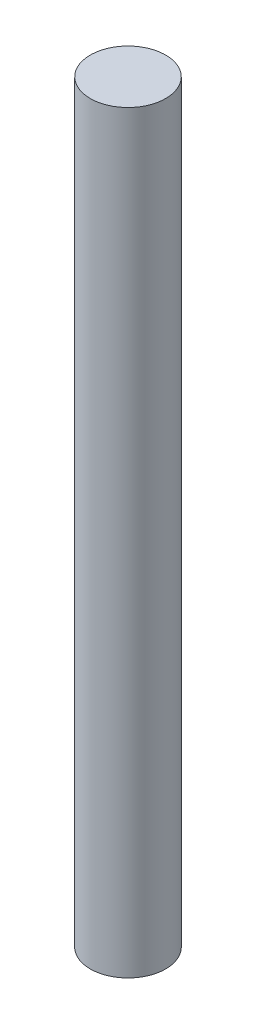
ISO-10303-21;
HEADER;
FILE_DESCRIPTION(('STEP AP214'),'2;1');
FILE_NAME('part.step','',(''),(''),'','','');
FILE_SCHEMA(('AUTOMOTIVE_DESIGN { 1 0 10303 214 1 1 1 1 }'));
ENDSEC;
DATA;
#1=APPLICATION_CONTEXT('core data for automotive mechanical design processes');
#2=APPLICATION_PROTOCOL_DEFINITION('international standard','automotive_design',2000,#1);
#3=PRODUCT_CONTEXT('',#1,'mechanical');
#4=PRODUCT('Part','Part','',(#3));
#5=PRODUCT_RELATED_PRODUCT_CATEGORY('part','',(#4));
#6=PRODUCT_DEFINITION_FORMATION('','',#4);
#7=PRODUCT_DEFINITION_CONTEXT('part definition',#1,'design');
#8=PRODUCT_DEFINITION('design','',#6,#7);
#9=PRODUCT_DEFINITION_SHAPE('','',#8);
#10=(LENGTH_UNIT() NAMED_UNIT(*) SI_UNIT(.MILLI.,.METRE.));
#11=(NAMED_UNIT(*) PLANE_ANGLE_UNIT() SI_UNIT($,.RADIAN.));
#12=(NAMED_UNIT(*) SI_UNIT($,.STERADIAN.) SOLID_ANGLE_UNIT());
#13=UNCERTAINTY_MEASURE_WITH_UNIT(LENGTH_MEASURE(1.E-05),#10,'distance_accuracy_value','');
#14=(GEOMETRIC_REPRESENTATION_CONTEXT(3) GLOBAL_UNCERTAINTY_ASSIGNED_CONTEXT((#13)) GLOBAL_UNIT_ASSIGNED_CONTEXT((#10,
#11,#12)) REPRESENTATION_CONTEXT('',''));
#15=CARTESIAN_POINT('',(0.,0.,0.));
#16=DIRECTION('',(0.,0.,1.));
#17=DIRECTION('',(1.,0.,0.));
#18=AXIS2_PLACEMENT_3D('',#15,#16,#17);
#19=CARTESIAN_POINT('',(0.,200.,0.));
#20=DIRECTION('',(0.,-1.,0.));
#21=DIRECTION('',(0.,0.,-1.));
#22=AXIS2_PLACEMENT_3D('',#19,#20,#21);
#23=CYLINDRICAL_SURFACE('',#22,10.);
#24=CARTESIAN_POINT('',(0.,200.,0.));
#25=DIRECTION('',(0.,1.,0.));
#26=DIRECTION('',(0.,0.,1.));
#27=AXIS2_PLACEMENT_3D('',#24,#25,#26);
#28=CIRCLE('',#27,10.);
#29=CARTESIAN_POINT('',(0.,200.,10.));
#30=VERTEX_POINT('',#29);
#31=EDGE_CURVE('E10',#30,#30,#28,.T.);
#32=ORIENTED_EDGE('',*,*,#31,.F.);
#33=EDGE_LOOP('',(#32));
#34=FACE_BOUND('',#33,.T.);
#35=CARTESIAN_POINT('',(0.,0.,0.));
#36=DIRECTION('',(0.,1.,0.));
#37=DIRECTION('',(0.,0.,1.));
#38=AXIS2_PLACEMENT_3D('',#35,#36,#37);
#39=CIRCLE('',#38,10.);
#40=CARTESIAN_POINT('',(0.,0.,10.));
#41=VERTEX_POINT('',#40);
#42=EDGE_CURVE('E30',#41,#41,#39,.T.);
#43=ORIENTED_EDGE('',*,*,#42,.T.);
#44=EDGE_LOOP('',(#43));
#45=FACE_BOUND('',#44,.T.);
#46=ADVANCED_FACE('F24',(#34,#45),#23,.T.);
#47=CARTESIAN_POINT('',(0.,200.,0.));
#48=DIRECTION('',(0.,1.,0.));
#49=DIRECTION('',(0.,0.,1.));
#50=AXIS2_PLACEMENT_3D('',#47,#48,#49);
#51=PLANE('',#50);
#52=ORIENTED_EDGE('',*,*,#31,.T.);
#53=EDGE_LOOP('',(#52));
#54=FACE_BOUND('',#53,.T.);
#55=ADVANCED_FACE('F39',(#54),#51,.T.);
#56=CARTESIAN_POINT('',(0.,0.,0.));
#57=DIRECTION('',(0.,1.,0.));
#58=DIRECTION('',(0.,0.,1.));
#59=AXIS2_PLACEMENT_3D('',#56,#57,#58);
#60=PLANE('',#59);
#61=ORIENTED_EDGE('',*,*,#42,.F.);
#62=EDGE_LOOP('',(#61));
#63=FACE_BOUND('',#62,.T.);
#64=ADVANCED_FACE('F37',(#63),#60,.F.);
#65=CLOSED_SHELL('',(#46,#55,#64));
#66=MANIFOLD_SOLID_BREP('B2',#65);
#67=ADVANCED_BREP_SHAPE_REPRESENTATION('',(#18,#66),#14);
#68=SHAPE_DEFINITION_REPRESENTATION(#9,#67);
ENDSEC;
END-ISO-10303-21;
